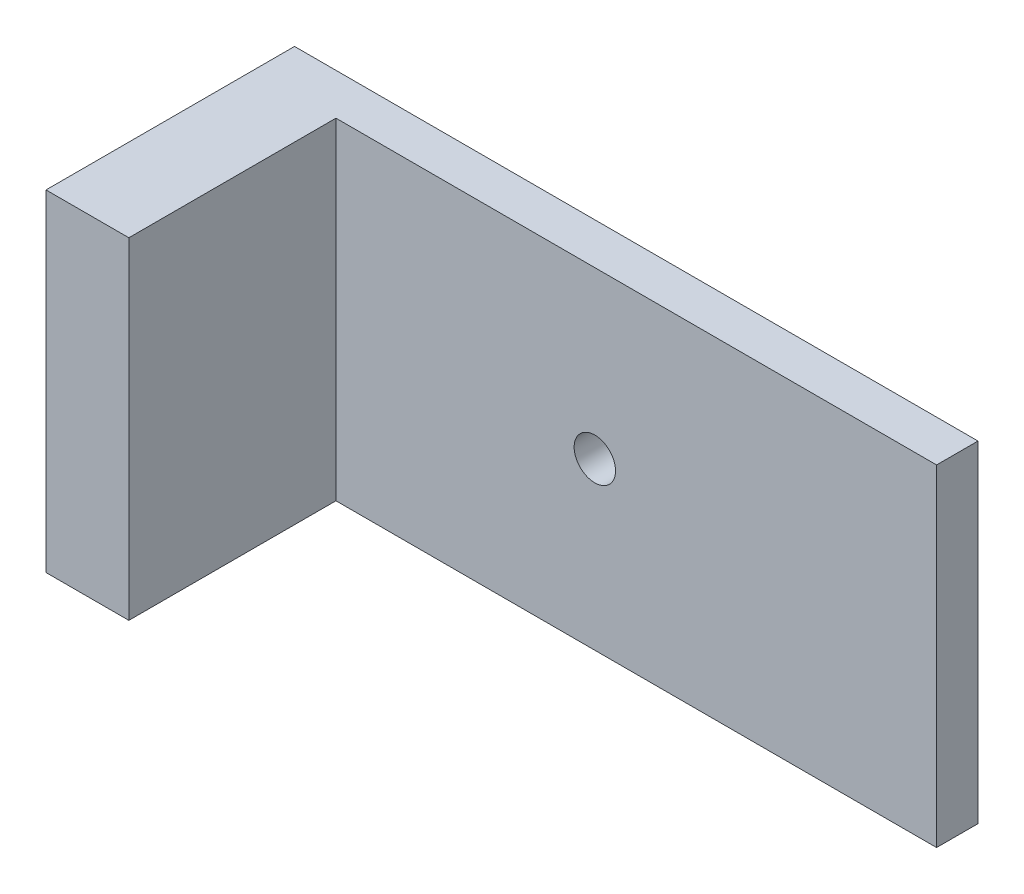
ISO-10303-21;
HEADER;
FILE_DESCRIPTION(('STEP AP214'),'2;1');
FILE_NAME('part.step','',(''),(''),'','','');
FILE_SCHEMA(('AUTOMOTIVE_DESIGN { 1 0 10303 214 1 1 1 1 }'));
ENDSEC;
DATA;
#1=APPLICATION_CONTEXT('core data for automotive mechanical design processes');
#2=APPLICATION_PROTOCOL_DEFINITION('international standard','automotive_design',2000,#1);
#3=PRODUCT_CONTEXT('',#1,'mechanical');
#4=PRODUCT('Part','Part','',(#3));
#5=PRODUCT_RELATED_PRODUCT_CATEGORY('part','',(#4));
#6=PRODUCT_DEFINITION_FORMATION('','',#4);
#7=PRODUCT_DEFINITION_CONTEXT('part definition',#1,'design');
#8=PRODUCT_DEFINITION('design','',#6,#7);
#9=PRODUCT_DEFINITION_SHAPE('','',#8);
#10=(LENGTH_UNIT() NAMED_UNIT(*) SI_UNIT(.MILLI.,.METRE.));
#11=(NAMED_UNIT(*) PLANE_ANGLE_UNIT() SI_UNIT($,.RADIAN.));
#12=(NAMED_UNIT(*) SI_UNIT($,.STERADIAN.) SOLID_ANGLE_UNIT());
#13=UNCERTAINTY_MEASURE_WITH_UNIT(LENGTH_MEASURE(1.E-05),#10,'distance_accuracy_value','');
#14=(GEOMETRIC_REPRESENTATION_CONTEXT(3) GLOBAL_UNCERTAINTY_ASSIGNED_CONTEXT((#13)) GLOBAL_UNIT_ASSIGNED_CONTEXT((#10,
#11,#12)) REPRESENTATION_CONTEXT('',''));
#15=CARTESIAN_POINT('',(0.,0.,0.));
#16=DIRECTION('',(0.,0.,1.));
#17=DIRECTION('',(1.,0.,0.));
#18=AXIS2_PLACEMENT_3D('',#15,#16,#17);
#19=CARTESIAN_POINT('',(0.,0.,10.));
#20=DIRECTION('',(0.,0.,-1.));
#21=DIRECTION('',(-1.,0.,0.));
#22=AXIS2_PLACEMENT_3D('',#19,#20,#21);
#23=PLANE('',#22);
#24=CARTESIAN_POINT('',(0.,0.,10.));
#25=DIRECTION('',(0.,0.,1.));
#26=DIRECTION('',(1.,0.,0.));
#27=AXIS2_PLACEMENT_3D('',#24,#25,#26);
#28=CIRCLE('',#27,5.);
#29=CARTESIAN_POINT('',(5.,0.,10.));
#30=VERTEX_POINT('',#29);
#31=EDGE_CURVE('E139',#30,#30,#28,.T.);
#32=ORIENTED_EDGE('',*,*,#31,.F.);
#33=EDGE_LOOP('',(#32));
#34=FACE_BOUND('',#33,.T.);
#35=DIRECTION('',(0.,1.,0.));
#36=VECTOR('',#35,1.);
#37=CARTESIAN_POINT('',(-62.5,40.,10.));
#38=LINE('',#37,#36);
#39=CARTESIAN_POINT('',(-62.5,-40.,10.));
#40=VERTEX_POINT('',#39);
#41=CARTESIAN_POINT('',(-62.5,40.,10.));
#42=VERTEX_POINT('',#41);
#43=EDGE_CURVE('E54',#40,#42,#38,.T.);
#44=ORIENTED_EDGE('',*,*,#43,.F.);
#45=DIRECTION('',(1.,0.,0.));
#46=VECTOR('',#45,1.);
#47=CARTESIAN_POINT('',(-82.5,-40.,10.));
#48=LINE('',#47,#46);
#49=CARTESIAN_POINT('',(82.5,-40.,10.));
#50=VERTEX_POINT('',#49);
#51=EDGE_CURVE('E59',#40,#50,#48,.T.);
#52=ORIENTED_EDGE('',*,*,#51,.T.);
#53=DIRECTION('',(0.,1.,0.));
#54=VECTOR('',#53,1.);
#55=CARTESIAN_POINT('',(82.5,-40.,10.));
#56=LINE('',#55,#54);
#57=CARTESIAN_POINT('',(82.5,40.,10.));
#58=VERTEX_POINT('',#57);
#59=EDGE_CURVE('E90',#50,#58,#56,.T.);
#60=ORIENTED_EDGE('',*,*,#59,.T.);
#61=DIRECTION('',(-1.,0.,0.));
#62=VECTOR('',#61,1.);
#63=CARTESIAN_POINT('',(-82.5,40.,10.));
#64=LINE('',#63,#62);
#65=EDGE_CURVE('E141',#58,#42,#64,.T.);
#66=ORIENTED_EDGE('',*,*,#65,.T.);
#67=EDGE_LOOP('',(#44,#52,#60,#66));
#68=FACE_BOUND('',#67,.T.);
#69=ADVANCED_FACE('F39',(#34,#68),#23,.F.);
#70=CARTESIAN_POINT('',(82.5,-40.,10.));
#71=DIRECTION('',(-1.,0.,0.));
#72=DIRECTION('',(0.,0.,1.));
#73=AXIS2_PLACEMENT_3D('',#70,#71,#72);
#74=PLANE('',#73);
#75=DIRECTION('',(0.,1.,0.));
#76=VECTOR('',#75,1.);
#77=CARTESIAN_POINT('',(82.5,-40.,0.));
#78=LINE('',#77,#76);
#79=CARTESIAN_POINT('',(82.5,-40.,0.));
#80=VERTEX_POINT('',#79);
#81=CARTESIAN_POINT('',(82.5,40.,0.));
#82=VERTEX_POINT('',#81);
#83=EDGE_CURVE('E96',#80,#82,#78,.T.);
#84=ORIENTED_EDGE('',*,*,#83,.T.);
#85=DIRECTION('',(0.,0.,-1.));
#86=VECTOR('',#85,1.);
#87=CARTESIAN_POINT('',(82.5,40.,10.));
#88=LINE('',#87,#86);
#89=EDGE_CURVE('E11',#58,#82,#88,.T.);
#90=ORIENTED_EDGE('',*,*,#89,.F.);
#91=ORIENTED_EDGE('',*,*,#59,.F.);
#92=DIRECTION('',(0.,0.,-1.));
#93=VECTOR('',#92,1.);
#94=CARTESIAN_POINT('',(82.5,-40.,10.));
#95=LINE('',#94,#93);
#96=EDGE_CURVE('E82',#50,#80,#95,.T.);
#97=ORIENTED_EDGE('',*,*,#96,.T.);
#98=EDGE_LOOP('',(#84,#90,#91,#97));
#99=FACE_BOUND('',#98,.T.);
#100=ADVANCED_FACE('F41',(#99),#74,.F.);
#101=CARTESIAN_POINT('',(-82.5,40.,10.));
#102=DIRECTION('',(0.,-1.,0.));
#103=DIRECTION('',(0.,0.,-1.));
#104=AXIS2_PLACEMENT_3D('',#101,#102,#103);
#105=PLANE('',#104);
#106=DIRECTION('',(-1.,0.,0.));
#107=VECTOR('',#106,1.);
#108=CARTESIAN_POINT('',(-82.5,40.,0.));
#109=LINE('',#108,#107);
#110=CARTESIAN_POINT('',(-82.5,40.,0.));
#111=VERTEX_POINT('',#110);
#112=EDGE_CURVE('E99',#82,#111,#109,.T.);
#113=ORIENTED_EDGE('',*,*,#112,.T.);
#114=DIRECTION('',(0.,0.,-1.));
#115=VECTOR('',#114,1.);
#116=CARTESIAN_POINT('',(-82.5,40.,10.));
#117=LINE('',#116,#115);
#118=CARTESIAN_POINT('',(-82.5,40.,60.));
#119=VERTEX_POINT('',#118);
#120=EDGE_CURVE('E47',#119,#111,#117,.T.);
#121=ORIENTED_EDGE('',*,*,#120,.F.);
#122=DIRECTION('',(-1.,0.,0.));
#123=VECTOR('',#122,1.);
#124=CARTESIAN_POINT('',(-82.5,40.,60.));
#125=LINE('',#124,#123);
#126=CARTESIAN_POINT('',(-62.5,40.,60.));
#127=VERTEX_POINT('',#126);
#128=EDGE_CURVE('E123',#127,#119,#125,.T.);
#129=ORIENTED_EDGE('',*,*,#128,.F.);
#130=DIRECTION('',(0.,0.,-1.));
#131=VECTOR('',#130,1.);
#132=CARTESIAN_POINT('',(-62.5,40.,60.));
#133=LINE('',#132,#131);
#134=EDGE_CURVE('E104',#127,#42,#133,.T.);
#135=ORIENTED_EDGE('',*,*,#134,.T.);
#136=ORIENTED_EDGE('',*,*,#65,.F.);
#137=ORIENTED_EDGE('',*,*,#89,.T.);
#138=EDGE_LOOP('',(#113,#121,#129,#135,#136,#137));
#139=FACE_BOUND('',#138,.T.);
#140=ADVANCED_FACE('F120',(#139),#105,.F.);
#141=CARTESIAN_POINT('',(-82.5,-40.,10.));
#142=DIRECTION('',(1.,0.,0.));
#143=DIRECTION('',(0.,0.,-1.));
#144=AXIS2_PLACEMENT_3D('',#141,#142,#143);
#145=PLANE('',#144);
#146=DIRECTION('',(0.,-1.,0.));
#147=VECTOR('',#146,1.);
#148=CARTESIAN_POINT('',(-82.5,-40.,0.));
#149=LINE('',#148,#147);
#150=CARTESIAN_POINT('',(-82.5,-40.,0.));
#151=VERTEX_POINT('',#150);
#152=EDGE_CURVE('E91',#111,#151,#149,.T.);
#153=ORIENTED_EDGE('',*,*,#152,.T.);
#154=DIRECTION('',(0.,0.,-1.));
#155=VECTOR('',#154,1.);
#156=CARTESIAN_POINT('',(-82.5,-40.,10.));
#157=LINE('',#156,#155);
#158=CARTESIAN_POINT('',(-82.5,-40.,60.));
#159=VERTEX_POINT('',#158);
#160=EDGE_CURVE('E86',#159,#151,#157,.T.);
#161=ORIENTED_EDGE('',*,*,#160,.F.);
#162=DIRECTION('',(0.,-1.,0.));
#163=VECTOR('',#162,1.);
#164=CARTESIAN_POINT('',(-82.5,40.,60.));
#165=LINE('',#164,#163);
#166=EDGE_CURVE('E116',#119,#159,#165,.T.);
#167=ORIENTED_EDGE('',*,*,#166,.F.);
#168=ORIENTED_EDGE('',*,*,#120,.T.);
#169=EDGE_LOOP('',(#153,#161,#167,#168));
#170=FACE_BOUND('',#169,.T.);
#171=ADVANCED_FACE('F114',(#170),#145,.F.);
#172=CARTESIAN_POINT('',(-82.5,-40.,10.));
#173=DIRECTION('',(0.,1.,0.));
#174=DIRECTION('',(0.,0.,1.));
#175=AXIS2_PLACEMENT_3D('',#172,#173,#174);
#176=PLANE('',#175);
#177=DIRECTION('',(1.,0.,0.));
#178=VECTOR('',#177,1.);
#179=CARTESIAN_POINT('',(-82.5,-40.,0.));
#180=LINE('',#179,#178);
#181=EDGE_CURVE('E79',#151,#80,#180,.T.);
#182=ORIENTED_EDGE('',*,*,#181,.T.);
#183=ORIENTED_EDGE('',*,*,#96,.F.);
#184=ORIENTED_EDGE('',*,*,#51,.F.);
#185=DIRECTION('',(0.,0.,-1.));
#186=VECTOR('',#185,1.);
#187=CARTESIAN_POINT('',(-62.5,-40.,60.));
#188=LINE('',#187,#186);
#189=CARTESIAN_POINT('',(-62.5,-40.,60.));
#190=VERTEX_POINT('',#189);
#191=EDGE_CURVE('E100',#190,#40,#188,.T.);
#192=ORIENTED_EDGE('',*,*,#191,.F.);
#193=DIRECTION('',(1.,0.,0.));
#194=VECTOR('',#193,1.);
#195=CARTESIAN_POINT('',(-82.5,-40.,60.));
#196=LINE('',#195,#194);
#197=EDGE_CURVE('E135',#159,#190,#196,.T.);
#198=ORIENTED_EDGE('',*,*,#197,.F.);
#199=ORIENTED_EDGE('',*,*,#160,.T.);
#200=EDGE_LOOP('',(#182,#183,#184,#192,#198,#199));
#201=FACE_BOUND('',#200,.T.);
#202=ADVANCED_FACE('F81',(#201),#176,.F.);
#203=CARTESIAN_POINT('',(0.,0.,0.));
#204=DIRECTION('',(0.,0.,-1.));
#205=DIRECTION('',(-1.,0.,0.));
#206=AXIS2_PLACEMENT_3D('',#203,#204,#205);
#207=PLANE('',#206);
#208=CARTESIAN_POINT('',(0.,0.,0.));
#209=DIRECTION('',(0.,0.,-1.));
#210=DIRECTION('',(-1.,0.,0.));
#211=AXIS2_PLACEMENT_3D('',#208,#209,#210);
#212=CIRCLE('',#211,5.);
#213=CARTESIAN_POINT('',(-5.,0.,0.));
#214=VERTEX_POINT('',#213);
#215=EDGE_CURVE('E152',#214,#214,#212,.F.);
#216=ORIENTED_EDGE('',*,*,#215,.T.);
#217=EDGE_LOOP('',(#216));
#218=FACE_BOUND('',#217,.T.);
#219=ORIENTED_EDGE('',*,*,#83,.F.);
#220=ORIENTED_EDGE('',*,*,#181,.F.);
#221=ORIENTED_EDGE('',*,*,#152,.F.);
#222=ORIENTED_EDGE('',*,*,#112,.F.);
#223=EDGE_LOOP('',(#219,#220,#221,#222));
#224=FACE_BOUND('',#223,.T.);
#225=ADVANCED_FACE('F98',(#218,#224),#207,.T.);
#226=CARTESIAN_POINT('',(-62.5,40.,60.));
#227=DIRECTION('',(-1.,0.,0.));
#228=DIRECTION('',(0.,-1.,0.));
#229=AXIS2_PLACEMENT_3D('',#226,#227,#228);
#230=PLANE('',#229);
#231=ORIENTED_EDGE('',*,*,#43,.T.);
#232=ORIENTED_EDGE('',*,*,#134,.F.);
#233=DIRECTION('',(0.,1.,0.));
#234=VECTOR('',#233,1.);
#235=CARTESIAN_POINT('',(-62.5,40.,60.));
#236=LINE('',#235,#234);
#237=EDGE_CURVE('E131',#190,#127,#236,.T.);
#238=ORIENTED_EDGE('',*,*,#237,.F.);
#239=ORIENTED_EDGE('',*,*,#191,.T.);
#240=EDGE_LOOP('',(#231,#232,#238,#239));
#241=FACE_BOUND('',#240,.T.);
#242=ADVANCED_FACE('F144',(#241),#230,.F.);
#243=CARTESIAN_POINT('',(0.,0.,60.));
#244=DIRECTION('',(0.,0.,1.));
#245=DIRECTION('',(1.,0.,0.));
#246=AXIS2_PLACEMENT_3D('',#243,#244,#245);
#247=PLANE('',#246);
#248=ORIENTED_EDGE('',*,*,#166,.T.);
#249=ORIENTED_EDGE('',*,*,#197,.T.);
#250=ORIENTED_EDGE('',*,*,#237,.T.);
#251=ORIENTED_EDGE('',*,*,#128,.T.);
#252=EDGE_LOOP('',(#248,#249,#250,#251));
#253=FACE_BOUND('',#252,.T.);
#254=ADVANCED_FACE('F127',(#253),#247,.T.);
#255=CARTESIAN_POINT('',(0.,0.,-0.000999999999999265));
#256=DIRECTION('',(0.,0.,1.));
#257=DIRECTION('',(1.,0.,0.));
#258=AXIS2_PLACEMENT_3D('',#255,#256,#257);
#259=CYLINDRICAL_SURFACE('',#258,5.);
#260=ORIENTED_EDGE('',*,*,#215,.F.);
#261=EDGE_LOOP('',(#260));
#262=FACE_BOUND('',#261,.T.);
#263=ORIENTED_EDGE('',*,*,#31,.T.);
#264=EDGE_LOOP('',(#263));
#265=FACE_BOUND('',#264,.T.);
#266=ADVANCED_FACE('F158',(#262,#265),#259,.F.);
#267=CLOSED_SHELL('',(#69,#100,#140,#171,#202,#225,#242,#254,#266));
#268=MANIFOLD_SOLID_BREP('B2',#267);
#269=ADVANCED_BREP_SHAPE_REPRESENTATION('',(#18,#268),#14);
#270=SHAPE_DEFINITION_REPRESENTATION(#9,#269);
ENDSEC;
END-ISO-10303-21;
